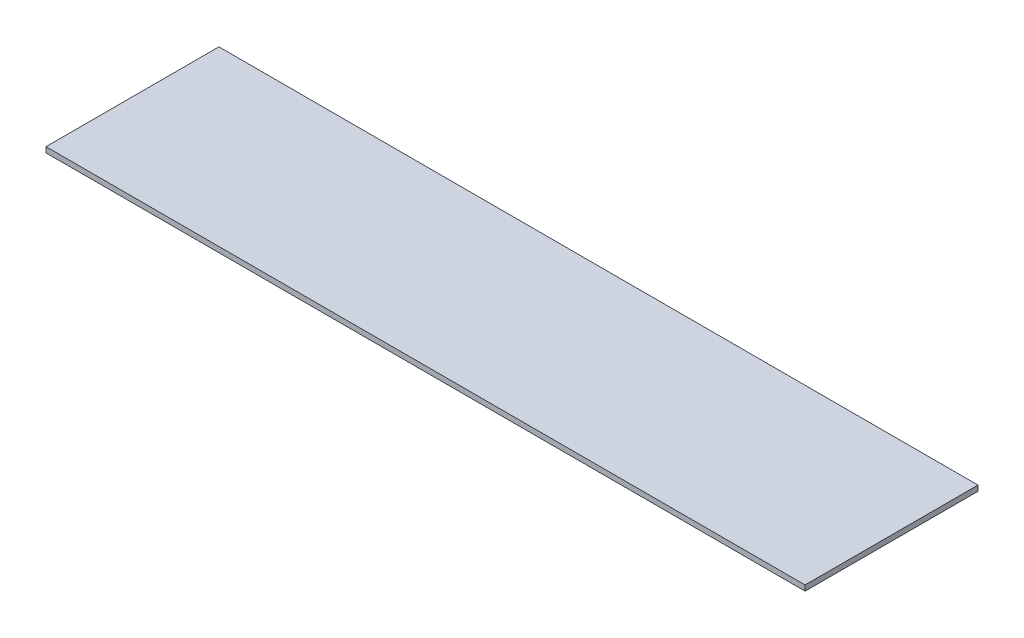
ISO-10303-21;
HEADER;
FILE_DESCRIPTION(('STEP AP214'),'2;1');
FILE_NAME('part.step','',(''),(''),'','','');
FILE_SCHEMA(('AUTOMOTIVE_DESIGN { 1 0 10303 214 1 1 1 1 }'));
ENDSEC;
DATA;
#1=APPLICATION_CONTEXT('core data for automotive mechanical design processes');
#2=APPLICATION_PROTOCOL_DEFINITION('international standard','automotive_design',2000,#1);
#3=PRODUCT_CONTEXT('',#1,'mechanical');
#4=PRODUCT('Part','Part','',(#3));
#5=PRODUCT_RELATED_PRODUCT_CATEGORY('part','',(#4));
#6=PRODUCT_DEFINITION_FORMATION('','',#4);
#7=PRODUCT_DEFINITION_CONTEXT('part definition',#1,'design');
#8=PRODUCT_DEFINITION('design','',#6,#7);
#9=PRODUCT_DEFINITION_SHAPE('','',#8);
#10=(LENGTH_UNIT() NAMED_UNIT(*) SI_UNIT(.MILLI.,.METRE.));
#11=(NAMED_UNIT(*) PLANE_ANGLE_UNIT() SI_UNIT($,.RADIAN.));
#12=(NAMED_UNIT(*) SI_UNIT($,.STERADIAN.) SOLID_ANGLE_UNIT());
#13=UNCERTAINTY_MEASURE_WITH_UNIT(LENGTH_MEASURE(1.E-05),#10,'distance_accuracy_value','');
#14=(GEOMETRIC_REPRESENTATION_CONTEXT(3) GLOBAL_UNCERTAINTY_ASSIGNED_CONTEXT((#13)) GLOBAL_UNIT_ASSIGNED_CONTEXT((#10,
#11,#12)) REPRESENTATION_CONTEXT('',''));
#15=CARTESIAN_POINT('',(0.,0.,0.));
#16=DIRECTION('',(0.,0.,1.));
#17=DIRECTION('',(1.,0.,0.));
#18=AXIS2_PLACEMENT_3D('',#15,#16,#17);
#19=CARTESIAN_POINT('',(446.,3.175,0.));
#20=DIRECTION('',(0.,0.,-1.));
#21=DIRECTION('',(-1.,0.,0.));
#22=AXIS2_PLACEMENT_3D('',#19,#20,#21);
#23=PLANE('',#22);
#24=DIRECTION('',(1.,0.,0.));
#25=VECTOR('',#24,1.);
#26=CARTESIAN_POINT('',(446.,0.,0.));
#27=LINE('',#26,#25);
#28=CARTESIAN_POINT('',(0.,0.,0.));
#29=VERTEX_POINT('',#28);
#30=CARTESIAN_POINT('',(446.,0.,0.));
#31=VERTEX_POINT('',#30);
#32=EDGE_CURVE('E105',#29,#31,#27,.T.);
#33=ORIENTED_EDGE('',*,*,#32,.T.);
#34=DIRECTION('',(0.,-1.,0.));
#35=VECTOR('',#34,1.);
#36=CARTESIAN_POINT('',(446.,3.175,0.));
#37=LINE('',#36,#35);
#38=CARTESIAN_POINT('',(446.,3.175,0.));
#39=VERTEX_POINT('',#38);
#40=EDGE_CURVE('E11',#39,#31,#37,.T.);
#41=ORIENTED_EDGE('',*,*,#40,.F.);
#42=DIRECTION('',(1.,0.,0.));
#43=VECTOR('',#42,1.);
#44=CARTESIAN_POINT('',(446.,3.175,0.));
#45=LINE('',#44,#43);
#46=CARTESIAN_POINT('',(0.,3.175,0.));
#47=VERTEX_POINT('',#46);
#48=EDGE_CURVE('E93',#47,#39,#45,.T.);
#49=ORIENTED_EDGE('',*,*,#48,.F.);
#50=DIRECTION('',(0.,-1.,0.));
#51=VECTOR('',#50,1.);
#52=CARTESIAN_POINT('',(0.,3.175,0.));
#53=LINE('',#52,#51);
#54=EDGE_CURVE('E101',#47,#29,#53,.T.);
#55=ORIENTED_EDGE('',*,*,#54,.T.);
#56=EDGE_LOOP('',(#33,#41,#49,#55));
#57=FACE_BOUND('',#56,.T.);
#58=ADVANCED_FACE('F42',(#57),#23,.F.);
#59=CARTESIAN_POINT('',(446.,3.175,-101.6));
#60=DIRECTION('',(-1.,0.,0.));
#61=DIRECTION('',(0.,0.,1.));
#62=AXIS2_PLACEMENT_3D('',#59,#60,#61);
#63=PLANE('',#62);
#64=DIRECTION('',(0.,0.,-1.));
#65=VECTOR('',#64,1.);
#66=CARTESIAN_POINT('',(446.,0.,-101.6));
#67=LINE('',#66,#65);
#68=CARTESIAN_POINT('',(446.,0.,-101.6));
#69=VERTEX_POINT('',#68);
#70=EDGE_CURVE('E97',#31,#69,#67,.T.);
#71=ORIENTED_EDGE('',*,*,#70,.T.);
#72=DIRECTION('',(0.,-1.,0.));
#73=VECTOR('',#72,1.);
#74=CARTESIAN_POINT('',(446.,3.175,-101.6));
#75=LINE('',#74,#73);
#76=CARTESIAN_POINT('',(446.,3.175,-101.6));
#77=VERTEX_POINT('',#76);
#78=EDGE_CURVE('E50',#77,#69,#75,.T.);
#79=ORIENTED_EDGE('',*,*,#78,.F.);
#80=DIRECTION('',(0.,0.,-1.));
#81=VECTOR('',#80,1.);
#82=CARTESIAN_POINT('',(446.,3.175,-101.6));
#83=LINE('',#82,#81);
#84=EDGE_CURVE('E88',#39,#77,#83,.T.);
#85=ORIENTED_EDGE('',*,*,#84,.F.);
#86=ORIENTED_EDGE('',*,*,#40,.T.);
#87=EDGE_LOOP('',(#71,#79,#85,#86));
#88=FACE_BOUND('',#87,.T.);
#89=ADVANCED_FACE('F96',(#88),#63,.F.);
#90=CARTESIAN_POINT('',(0.,3.175,-101.6));
#91=DIRECTION('',(0.,0.,1.));
#92=DIRECTION('',(1.,0.,0.));
#93=AXIS2_PLACEMENT_3D('',#90,#91,#92);
#94=PLANE('',#93);
#95=DIRECTION('',(-1.,0.,0.));
#96=VECTOR('',#95,1.);
#97=CARTESIAN_POINT('',(0.,0.,-101.6));
#98=LINE('',#97,#96);
#99=CARTESIAN_POINT('',(0.,0.,-101.6));
#100=VERTEX_POINT('',#99);
#101=EDGE_CURVE('E75',#69,#100,#98,.T.);
#102=ORIENTED_EDGE('',*,*,#101,.T.);
#103=DIRECTION('',(0.,-1.,0.));
#104=VECTOR('',#103,1.);
#105=CARTESIAN_POINT('',(0.,3.175,-101.6));
#106=LINE('',#105,#104);
#107=CARTESIAN_POINT('',(0.,3.175,-101.6));
#108=VERTEX_POINT('',#107);
#109=EDGE_CURVE('E98',#108,#100,#106,.T.);
#110=ORIENTED_EDGE('',*,*,#109,.F.);
#111=DIRECTION('',(-1.,0.,0.));
#112=VECTOR('',#111,1.);
#113=CARTESIAN_POINT('',(0.,3.175,-101.6));
#114=LINE('',#113,#112);
#115=EDGE_CURVE('E91',#77,#108,#114,.T.);
#116=ORIENTED_EDGE('',*,*,#115,.F.);
#117=ORIENTED_EDGE('',*,*,#78,.T.);
#118=EDGE_LOOP('',(#102,#110,#116,#117));
#119=FACE_BOUND('',#118,.T.);
#120=ADVANCED_FACE('F99',(#119),#94,.F.);
#121=CARTESIAN_POINT('',(0.,3.175,0.));
#122=DIRECTION('',(1.,0.,0.));
#123=DIRECTION('',(0.,0.,-1.));
#124=AXIS2_PLACEMENT_3D('',#121,#122,#123);
#125=PLANE('',#124);
#126=DIRECTION('',(0.,0.,1.));
#127=VECTOR('',#126,1.);
#128=CARTESIAN_POINT('',(0.,0.,0.));
#129=LINE('',#128,#127);
#130=EDGE_CURVE('E81',#100,#29,#129,.T.);
#131=ORIENTED_EDGE('',*,*,#130,.T.);
#132=ORIENTED_EDGE('',*,*,#54,.F.);
#133=DIRECTION('',(0.,0.,1.));
#134=VECTOR('',#133,1.);
#135=CARTESIAN_POINT('',(0.,3.175,0.));
#136=LINE('',#135,#134);
#137=EDGE_CURVE('E58',#108,#47,#136,.T.);
#138=ORIENTED_EDGE('',*,*,#137,.F.);
#139=ORIENTED_EDGE('',*,*,#109,.T.);
#140=EDGE_LOOP('',(#131,#132,#138,#139));
#141=FACE_BOUND('',#140,.T.);
#142=ADVANCED_FACE('F112',(#141),#125,.F.);
#143=CARTESIAN_POINT('',(0.,3.175,0.));
#144=DIRECTION('',(0.,-1.,0.));
#145=DIRECTION('',(0.,0.,-1.));
#146=AXIS2_PLACEMENT_3D('',#143,#144,#145);
#147=PLANE('',#146);
#148=ORIENTED_EDGE('',*,*,#48,.T.);
#149=ORIENTED_EDGE('',*,*,#84,.T.);
#150=ORIENTED_EDGE('',*,*,#115,.T.);
#151=ORIENTED_EDGE('',*,*,#137,.T.);
#152=EDGE_LOOP('',(#148,#149,#150,#151));
#153=FACE_BOUND('',#152,.T.);
#154=ADVANCED_FACE('F89',(#153),#147,.F.);
#155=CARTESIAN_POINT('',(0.,0.,0.));
#156=DIRECTION('',(0.,-1.,0.));
#157=DIRECTION('',(0.,0.,-1.));
#158=AXIS2_PLACEMENT_3D('',#155,#156,#157);
#159=PLANE('',#158);
#160=ORIENTED_EDGE('',*,*,#32,.F.);
#161=ORIENTED_EDGE('',*,*,#130,.F.);
#162=ORIENTED_EDGE('',*,*,#101,.F.);
#163=ORIENTED_EDGE('',*,*,#70,.F.);
#164=EDGE_LOOP('',(#160,#161,#162,#163));
#165=FACE_BOUND('',#164,.T.);
#166=ADVANCED_FACE('F115',(#165),#159,.T.);
#167=CLOSED_SHELL('',(#58,#89,#120,#142,#154,#166));
#168=MANIFOLD_SOLID_BREP('B2',#167);
#169=ADVANCED_BREP_SHAPE_REPRESENTATION('',(#18,#168),#14);
#170=SHAPE_DEFINITION_REPRESENTATION(#9,#169);
ENDSEC;
END-ISO-10303-21;
